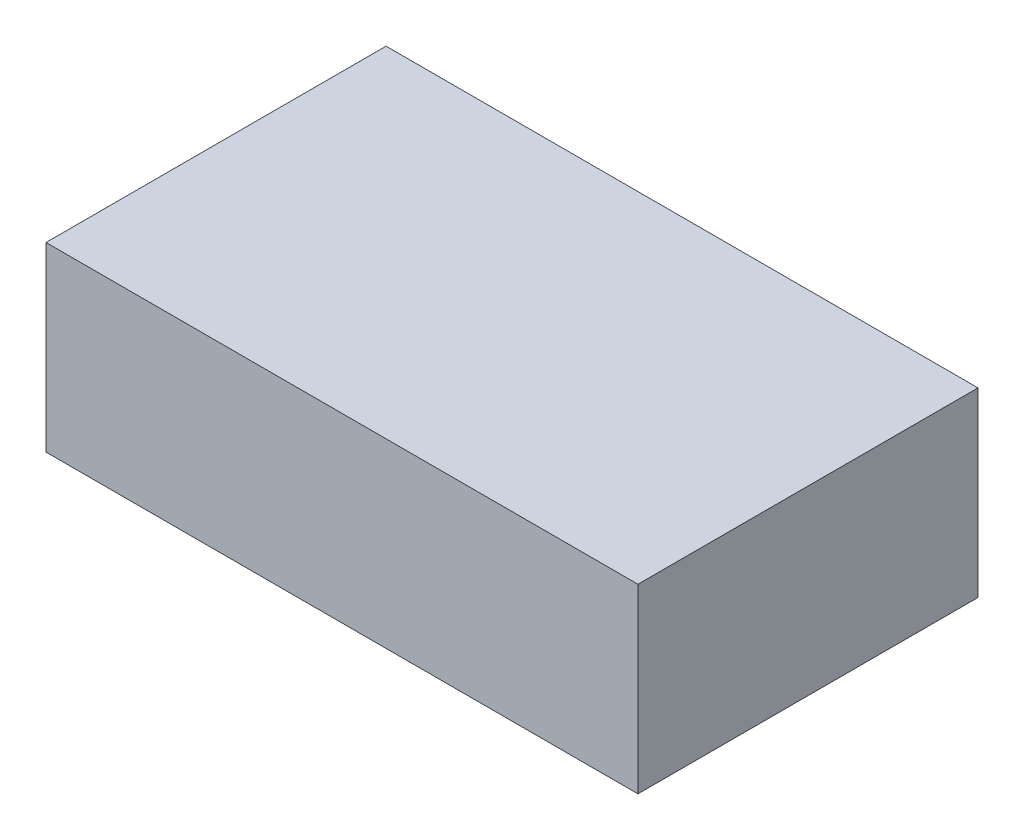
ISO-10303-21;
HEADER;
FILE_DESCRIPTION(('STEP AP214'),'2;1');
FILE_NAME('part.step','',(''),(''),'','','');
FILE_SCHEMA(('AUTOMOTIVE_DESIGN { 1 0 10303 214 1 1 1 1 }'));
ENDSEC;
DATA;
#1=APPLICATION_CONTEXT('core data for automotive mechanical design processes');
#2=APPLICATION_PROTOCOL_DEFINITION('international standard','automotive_design',2000,#1);
#3=PRODUCT_CONTEXT('',#1,'mechanical');
#4=PRODUCT('Part','Part','',(#3));
#5=PRODUCT_RELATED_PRODUCT_CATEGORY('part','',(#4));
#6=PRODUCT_DEFINITION_FORMATION('','',#4);
#7=PRODUCT_DEFINITION_CONTEXT('part definition',#1,'design');
#8=PRODUCT_DEFINITION('design','',#6,#7);
#9=PRODUCT_DEFINITION_SHAPE('','',#8);
#10=(LENGTH_UNIT() NAMED_UNIT(*) SI_UNIT(.MILLI.,.METRE.));
#11=(NAMED_UNIT(*) PLANE_ANGLE_UNIT() SI_UNIT($,.RADIAN.));
#12=(NAMED_UNIT(*) SI_UNIT($,.STERADIAN.) SOLID_ANGLE_UNIT());
#13=UNCERTAINTY_MEASURE_WITH_UNIT(LENGTH_MEASURE(1.E-05),#10,'distance_accuracy_value','');
#14=(GEOMETRIC_REPRESENTATION_CONTEXT(3) GLOBAL_UNCERTAINTY_ASSIGNED_CONTEXT((#13)) GLOBAL_UNIT_ASSIGNED_CONTEXT((#10,
#11,#12)) REPRESENTATION_CONTEXT('',''));
#15=CARTESIAN_POINT('',(0.,0.,0.));
#16=DIRECTION('',(0.,0.,1.));
#17=DIRECTION('',(1.,0.,0.));
#18=AXIS2_PLACEMENT_3D('',#15,#16,#17);
#19=CARTESIAN_POINT('',(0.,14.2,0.));
#20=DIRECTION('',(0.,0.,-1.));
#21=DIRECTION('',(-1.,0.,0.));
#22=AXIS2_PLACEMENT_3D('',#19,#20,#21);
#23=PLANE('',#22);
#24=DIRECTION('',(1.,0.,0.));
#25=VECTOR('',#24,1.);
#26=CARTESIAN_POINT('',(0.,0.,0.));
#27=LINE('',#26,#25);
#28=CARTESIAN_POINT('',(0.,0.,0.));
#29=VERTEX_POINT('',#28);
#30=CARTESIAN_POINT('',(46.3,0.,0.));
#31=VERTEX_POINT('',#30);
#32=EDGE_CURVE('E103',#29,#31,#27,.T.);
#33=ORIENTED_EDGE('',*,*,#32,.T.);
#34=DIRECTION('',(0.,-1.,0.));
#35=VECTOR('',#34,1.);
#36=CARTESIAN_POINT('',(46.3,14.2,0.));
#37=LINE('',#36,#35);
#38=CARTESIAN_POINT('',(46.3,14.2,0.));
#39=VERTEX_POINT('',#38);
#40=EDGE_CURVE('E11',#39,#31,#37,.T.);
#41=ORIENTED_EDGE('',*,*,#40,.F.);
#42=DIRECTION('',(1.,0.,0.));
#43=VECTOR('',#42,1.);
#44=CARTESIAN_POINT('',(0.,14.2,0.));
#45=LINE('',#44,#43);
#46=CARTESIAN_POINT('',(0.,14.2,0.));
#47=VERTEX_POINT('',#46);
#48=EDGE_CURVE('E89',#47,#39,#45,.T.);
#49=ORIENTED_EDGE('',*,*,#48,.F.);
#50=DIRECTION('',(0.,-1.,0.));
#51=VECTOR('',#50,1.);
#52=CARTESIAN_POINT('',(0.,14.2,0.));
#53=LINE('',#52,#51);
#54=EDGE_CURVE('E56',#47,#29,#53,.T.);
#55=ORIENTED_EDGE('',*,*,#54,.T.);
#56=EDGE_LOOP('',(#33,#41,#49,#55));
#57=FACE_BOUND('',#56,.T.);
#58=ADVANCED_FACE('F40',(#57),#23,.F.);
#59=CARTESIAN_POINT('',(46.3,14.2,0.));
#60=DIRECTION('',(-1.,0.,0.));
#61=DIRECTION('',(0.,0.,1.));
#62=AXIS2_PLACEMENT_3D('',#59,#60,#61);
#63=PLANE('',#62);
#64=DIRECTION('',(0.,0.,-1.));
#65=VECTOR('',#64,1.);
#66=CARTESIAN_POINT('',(46.3,0.,0.));
#67=LINE('',#66,#65);
#68=CARTESIAN_POINT('',(46.3,0.,-26.6));
#69=VERTEX_POINT('',#68);
#70=EDGE_CURVE('E94',#31,#69,#67,.T.);
#71=ORIENTED_EDGE('',*,*,#70,.T.);
#72=DIRECTION('',(0.,-1.,0.));
#73=VECTOR('',#72,1.);
#74=CARTESIAN_POINT('',(46.3,14.2,-26.6));
#75=LINE('',#74,#73);
#76=CARTESIAN_POINT('',(46.3,14.2,-26.6));
#77=VERTEX_POINT('',#76);
#78=EDGE_CURVE('E48',#77,#69,#75,.T.);
#79=ORIENTED_EDGE('',*,*,#78,.F.);
#80=DIRECTION('',(0.,0.,-1.));
#81=VECTOR('',#80,1.);
#82=CARTESIAN_POINT('',(46.3,14.2,0.));
#83=LINE('',#82,#81);
#84=EDGE_CURVE('E81',#39,#77,#83,.T.);
#85=ORIENTED_EDGE('',*,*,#84,.F.);
#86=ORIENTED_EDGE('',*,*,#40,.T.);
#87=EDGE_LOOP('',(#71,#79,#85,#86));
#88=FACE_BOUND('',#87,.T.);
#89=ADVANCED_FACE('F93',(#88),#63,.F.);
#90=CARTESIAN_POINT('',(0.,14.2,-26.6));
#91=DIRECTION('',(0.,0.,-1.));
#92=DIRECTION('',(-1.,0.,0.));
#93=AXIS2_PLACEMENT_3D('',#90,#91,#92);
#94=PLANE('',#93);
#95=DIRECTION('',(1.,0.,0.));
#96=VECTOR('',#95,1.);
#97=CARTESIAN_POINT('',(0.,0.,-26.6));
#98=LINE('',#97,#96);
#99=CARTESIAN_POINT('',(0.,0.,-26.6));
#100=VERTEX_POINT('',#99);
#101=EDGE_CURVE('E106',#100,#69,#98,.T.);
#102=ORIENTED_EDGE('',*,*,#101,.F.);
#103=DIRECTION('',(0.,-1.,0.));
#104=VECTOR('',#103,1.);
#105=CARTESIAN_POINT('',(0.,14.2,-26.6));
#106=LINE('',#105,#104);
#107=CARTESIAN_POINT('',(0.,14.2,-26.6));
#108=VERTEX_POINT('',#107);
#109=EDGE_CURVE('E70',#108,#100,#106,.T.);
#110=ORIENTED_EDGE('',*,*,#109,.F.);
#111=DIRECTION('',(1.,0.,0.));
#112=VECTOR('',#111,1.);
#113=CARTESIAN_POINT('',(0.,14.2,-26.6));
#114=LINE('',#113,#112);
#115=EDGE_CURVE('E88',#108,#77,#114,.T.);
#116=ORIENTED_EDGE('',*,*,#115,.T.);
#117=ORIENTED_EDGE('',*,*,#78,.T.);
#118=EDGE_LOOP('',(#102,#110,#116,#117));
#119=FACE_BOUND('',#118,.T.);
#120=ADVANCED_FACE('F97',(#119),#94,.T.);
#121=CARTESIAN_POINT('',(0.,14.2,0.));
#122=DIRECTION('',(-1.,0.,0.));
#123=DIRECTION('',(0.,0.,1.));
#124=AXIS2_PLACEMENT_3D('',#121,#122,#123);
#125=PLANE('',#124);
#126=DIRECTION('',(0.,0.,-1.));
#127=VECTOR('',#126,1.);
#128=CARTESIAN_POINT('',(0.,0.,0.));
#129=LINE('',#128,#127);
#130=EDGE_CURVE('E108',#29,#100,#129,.T.);
#131=ORIENTED_EDGE('',*,*,#130,.F.);
#132=ORIENTED_EDGE('',*,*,#54,.F.);
#133=DIRECTION('',(0.,0.,-1.));
#134=VECTOR('',#133,1.);
#135=CARTESIAN_POINT('',(0.,14.2,0.));
#136=LINE('',#135,#134);
#137=EDGE_CURVE('E98',#47,#108,#136,.T.);
#138=ORIENTED_EDGE('',*,*,#137,.T.);
#139=ORIENTED_EDGE('',*,*,#109,.T.);
#140=EDGE_LOOP('',(#131,#132,#138,#139));
#141=FACE_BOUND('',#140,.T.);
#142=ADVANCED_FACE('F114',(#141),#125,.T.);
#143=CARTESIAN_POINT('',(0.,14.2,0.));
#144=DIRECTION('',(0.,1.,0.));
#145=DIRECTION('',(0.,0.,1.));
#146=AXIS2_PLACEMENT_3D('',#143,#144,#145);
#147=PLANE('',#146);
#148=ORIENTED_EDGE('',*,*,#48,.T.);
#149=ORIENTED_EDGE('',*,*,#84,.T.);
#150=ORIENTED_EDGE('',*,*,#115,.F.);
#151=ORIENTED_EDGE('',*,*,#137,.F.);
#152=EDGE_LOOP('',(#148,#149,#150,#151));
#153=FACE_BOUND('',#152,.T.);
#154=ADVANCED_FACE('F85',(#153),#147,.T.);
#155=CARTESIAN_POINT('',(0.,0.,0.));
#156=DIRECTION('',(0.,1.,0.));
#157=DIRECTION('',(0.,0.,1.));
#158=AXIS2_PLACEMENT_3D('',#155,#156,#157);
#159=PLANE('',#158);
#160=ORIENTED_EDGE('',*,*,#32,.F.);
#161=ORIENTED_EDGE('',*,*,#130,.T.);
#162=ORIENTED_EDGE('',*,*,#101,.T.);
#163=ORIENTED_EDGE('',*,*,#70,.F.);
#164=EDGE_LOOP('',(#160,#161,#162,#163));
#165=FACE_BOUND('',#164,.T.);
#166=ADVANCED_FACE('F113',(#165),#159,.F.);
#167=CLOSED_SHELL('',(#58,#89,#120,#142,#154,#166));
#168=MANIFOLD_SOLID_BREP('B2',#167);
#169=ADVANCED_BREP_SHAPE_REPRESENTATION('',(#18,#168),#14);
#170=SHAPE_DEFINITION_REPRESENTATION(#9,#169);
ENDSEC;
END-ISO-10303-21;
